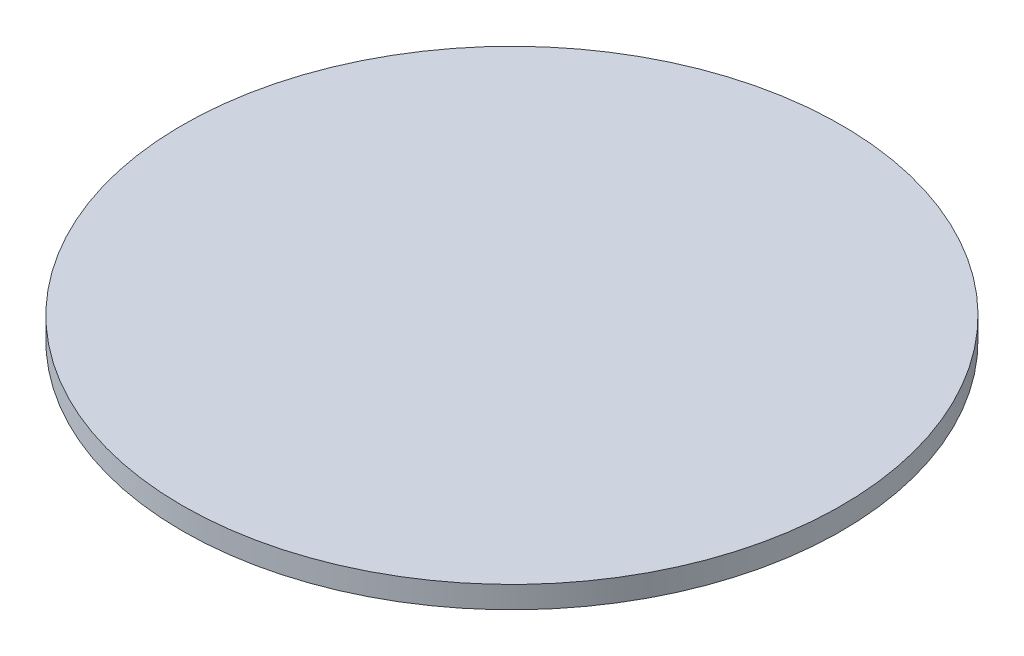
ISO-10303-21;
HEADER;
FILE_DESCRIPTION(('STEP AP214'),'2;1');
FILE_NAME('part.step','',(''),(''),'','','');
FILE_SCHEMA(('AUTOMOTIVE_DESIGN { 1 0 10303 214 1 1 1 1 }'));
ENDSEC;
DATA;
#1=APPLICATION_CONTEXT('core data for automotive mechanical design processes');
#2=APPLICATION_PROTOCOL_DEFINITION('international standard','automotive_design',2000,#1);
#3=PRODUCT_CONTEXT('',#1,'mechanical');
#4=PRODUCT('Part','Part','',(#3));
#5=PRODUCT_RELATED_PRODUCT_CATEGORY('part','',(#4));
#6=PRODUCT_DEFINITION_FORMATION('','',#4);
#7=PRODUCT_DEFINITION_CONTEXT('part definition',#1,'design');
#8=PRODUCT_DEFINITION('design','',#6,#7);
#9=PRODUCT_DEFINITION_SHAPE('','',#8);
#10=(LENGTH_UNIT() NAMED_UNIT(*) SI_UNIT(.MILLI.,.METRE.));
#11=(NAMED_UNIT(*) PLANE_ANGLE_UNIT() SI_UNIT($,.RADIAN.));
#12=(NAMED_UNIT(*) SI_UNIT($,.STERADIAN.) SOLID_ANGLE_UNIT());
#13=UNCERTAINTY_MEASURE_WITH_UNIT(LENGTH_MEASURE(1.E-05),#10,'distance_accuracy_value','');
#14=(GEOMETRIC_REPRESENTATION_CONTEXT(3) GLOBAL_UNCERTAINTY_ASSIGNED_CONTEXT((#13)) GLOBAL_UNIT_ASSIGNED_CONTEXT((#10,
#11,#12)) REPRESENTATION_CONTEXT('',''));
#15=CARTESIAN_POINT('',(0.,0.,0.));
#16=DIRECTION('',(0.,0.,1.));
#17=DIRECTION('',(1.,0.,0.));
#18=AXIS2_PLACEMENT_3D('',#15,#16,#17);
#19=CARTESIAN_POINT('',(0.,2.,0.));
#20=DIRECTION('',(0.,-1.,0.));
#21=DIRECTION('',(0.,0.,-1.));
#22=AXIS2_PLACEMENT_3D('',#19,#20,#21);
#23=CYLINDRICAL_SURFACE('',#22,30.);
#24=CARTESIAN_POINT('',(0.,2.,0.));
#25=DIRECTION('',(0.,1.,0.));
#26=DIRECTION('',(0.,0.,1.));
#27=AXIS2_PLACEMENT_3D('',#24,#25,#26);
#28=CIRCLE('',#27,30.);
#29=CARTESIAN_POINT('',(0.,2.,30.));
#30=VERTEX_POINT('',#29);
#31=EDGE_CURVE('E67',#30,#30,#28,.T.);
#32=ORIENTED_EDGE('',*,*,#31,.F.);
#33=EDGE_LOOP('',(#32));
#34=FACE_BOUND('',#33,.T.);
#35=CARTESIAN_POINT('',(0.,0.,0.));
#36=DIRECTION('',(0.,1.,0.));
#37=DIRECTION('',(0.,0.,1.));
#38=AXIS2_PLACEMENT_3D('',#35,#36,#37);
#39=CIRCLE('',#38,30.);
#40=CARTESIAN_POINT('',(0.,0.,30.));
#41=VERTEX_POINT('',#40);
#42=EDGE_CURVE('E68',#41,#41,#39,.T.);
#43=ORIENTED_EDGE('',*,*,#42,.T.);
#44=EDGE_LOOP('',(#43));
#45=FACE_BOUND('',#44,.T.);
#46=ADVANCED_FACE('F43',(#34,#45),#23,.T.);
#47=CARTESIAN_POINT('',(0.,2.,0.));
#48=DIRECTION('',(0.,1.,0.));
#49=DIRECTION('',(0.,0.,1.));
#50=AXIS2_PLACEMENT_3D('',#47,#48,#49);
#51=PLANE('',#50);
#52=ORIENTED_EDGE('',*,*,#31,.T.);
#53=EDGE_LOOP('',(#52));
#54=FACE_BOUND('',#53,.T.);
#55=ADVANCED_FACE('F98',(#54),#51,.T.);
#56=CARTESIAN_POINT('',(0.,0.,0.));
#57=DIRECTION('',(0.,1.,0.));
#58=DIRECTION('',(0.,0.,1.));
#59=AXIS2_PLACEMENT_3D('',#56,#57,#58);
#60=PLANE('',#59);
#61=CARTESIAN_POINT('',(0.,0.,0.));
#62=DIRECTION('',(0.,1.,0.));
#63=DIRECTION('',(0.,0.,1.));
#64=AXIS2_PLACEMENT_3D('',#61,#62,#63);
#65=CIRCLE('',#64,4.5);
#66=CARTESIAN_POINT('',(0.,0.,4.5));
#67=VERTEX_POINT('',#66);
#68=EDGE_CURVE('E56',#67,#67,#65,.T.);
#69=ORIENTED_EDGE('',*,*,#68,.T.);
#70=EDGE_LOOP('',(#69));
#71=FACE_BOUND('',#70,.T.);
#72=ORIENTED_EDGE('',*,*,#42,.F.);
#73=EDGE_LOOP('',(#72));
#74=FACE_BOUND('',#73,.T.);
#75=ADVANCED_FACE('F89',(#71,#74),#60,.F.);
#76=CARTESIAN_POINT('',(0.,-10.,0.));
#77=DIRECTION('',(0.,-1.,0.));
#78=DIRECTION('',(0.,0.,-1.));
#79=AXIS2_PLACEMENT_3D('',#76,#77,#78);
#80=PLANE('',#79);
#81=CARTESIAN_POINT('',(0.,-10.,0.));
#82=DIRECTION('',(0.,-1.,0.));
#83=DIRECTION('',(0.,0.,-1.));
#84=AXIS2_PLACEMENT_3D('',#81,#82,#83);
#85=CIRCLE('',#84,3.5);
#86=CARTESIAN_POINT('',(0.,-10.,-3.5));
#87=VERTEX_POINT('',#86);
#88=EDGE_CURVE('E72',#87,#87,#85,.T.);
#89=ORIENTED_EDGE('',*,*,#88,.T.);
#90=EDGE_LOOP('',(#89));
#91=FACE_BOUND('',#90,.T.);
#92=CARTESIAN_POINT('',(0.,-10.,0.));
#93=DIRECTION('',(0.,-1.,0.));
#94=DIRECTION('',(0.,0.,-1.));
#95=AXIS2_PLACEMENT_3D('',#92,#93,#94);
#96=CIRCLE('',#95,2.5);
#97=CARTESIAN_POINT('',(0.,-10.,-2.5));
#98=VERTEX_POINT('',#97);
#99=EDGE_CURVE('E79',#98,#98,#96,.T.);
#100=ORIENTED_EDGE('',*,*,#99,.F.);
#101=EDGE_LOOP('',(#100));
#102=FACE_BOUND('',#101,.T.);
#103=ADVANCED_FACE('F86',(#91,#102),#80,.T.);
#104=CARTESIAN_POINT('',(0.,-10.,0.));
#105=DIRECTION('',(0.,1.,0.));
#106=DIRECTION('',(0.,0.,1.));
#107=AXIS2_PLACEMENT_3D('',#104,#105,#106);
#108=CYLINDRICAL_SURFACE('',#107,3.5);
#109=CARTESIAN_POINT('',(0.,-0.999999999999999,0.));
#110=DIRECTION('',(0.,1.,0.));
#111=DIRECTION('',(0.,0.,1.));
#112=AXIS2_PLACEMENT_3D('',#109,#110,#111);
#113=CIRCLE('',#112,3.5);
#114=CARTESIAN_POINT('',(0.,-0.999999999999999,3.5));
#115=VERTEX_POINT('',#114);
#116=EDGE_CURVE('E61',#115,#115,#113,.F.);
#117=ORIENTED_EDGE('',*,*,#116,.T.);
#118=EDGE_LOOP('',(#117));
#119=FACE_BOUND('',#118,.T.);
#120=ORIENTED_EDGE('',*,*,#88,.F.);
#121=EDGE_LOOP('',(#120));
#122=FACE_BOUND('',#121,.T.);
#123=ADVANCED_FACE('F88',(#119,#122),#108,.T.);
#124=CARTESIAN_POINT('',(0.,-10.,0.));
#125=DIRECTION('',(0.,1.,0.));
#126=DIRECTION('',(0.,0.,1.));
#127=AXIS2_PLACEMENT_3D('',#124,#125,#126);
#128=CYLINDRICAL_SURFACE('',#127,2.5);
#129=CARTESIAN_POINT('',(0.,-0.999999999999999,0.));
#130=DIRECTION('',(0.,1.,0.));
#131=DIRECTION('',(0.,0.,1.));
#132=AXIS2_PLACEMENT_3D('',#129,#130,#131);
#133=CIRCLE('',#132,2.5);
#134=CARTESIAN_POINT('',(0.,-0.999999999999999,2.5));
#135=VERTEX_POINT('',#134);
#136=EDGE_CURVE('E10',#135,#135,#133,.T.);
#137=ORIENTED_EDGE('',*,*,#136,.T.);
#138=EDGE_LOOP('',(#137));
#139=FACE_BOUND('',#138,.T.);
#140=ORIENTED_EDGE('',*,*,#99,.T.);
#141=EDGE_LOOP('',(#140));
#142=FACE_BOUND('',#141,.T.);
#143=ADVANCED_FACE('F84',(#139,#142),#128,.F.);
#144=CARTESIAN_POINT('',(0.,0.,0.));
#145=DIRECTION('',(0.,1.,0.));
#146=DIRECTION('',(0.,0.,1.));
#147=AXIS2_PLACEMENT_3D('',#144,#145,#146);
#148=CIRCLE('',#147,1.5);
#149=CARTESIAN_POINT('',(0.,0.,1.5));
#150=VERTEX_POINT('',#149);
#151=EDGE_CURVE('E51',#150,#150,#148,.F.);
#152=ORIENTED_EDGE('',*,*,#151,.T.);
#153=EDGE_LOOP('',(#152));
#154=FACE_BOUND('',#153,.T.);
#155=ADVANCED_FACE('F101',(#154),#60,.F.);
#156=CARTESIAN_POINT('',(0.,-0.999999999999999,0.));
#157=DIRECTION('',(0.,1.,0.));
#158=DIRECTION('',(0.,0.,1.));
#159=AXIS2_PLACEMENT_3D('',#156,#157,#158);
#160=TOROIDAL_SURFACE('',#159,4.5,1.);
#161=ORIENTED_EDGE('',*,*,#68,.F.);
#162=EDGE_LOOP('',(#161));
#163=FACE_BOUND('',#162,.T.);
#164=ORIENTED_EDGE('',*,*,#116,.F.);
#165=EDGE_LOOP('',(#164));
#166=FACE_BOUND('',#165,.T.);
#167=ADVANCED_FACE('F113',(#163,#166),#160,.F.);
#168=CARTESIAN_POINT('',(0.,-0.999999999999999,0.));
#169=DIRECTION('',(0.,1.,0.));
#170=DIRECTION('',(0.,0.,1.));
#171=AXIS2_PLACEMENT_3D('',#168,#169,#170);
#172=TOROIDAL_SURFACE('',#171,1.5,1.);
#173=ORIENTED_EDGE('',*,*,#136,.F.);
#174=EDGE_LOOP('',(#173));
#175=FACE_BOUND('',#174,.T.);
#176=ORIENTED_EDGE('',*,*,#151,.F.);
#177=EDGE_LOOP('',(#176));
#178=FACE_BOUND('',#177,.T.);
#179=ADVANCED_FACE('F45',(#175,#178),#172,.F.);
#180=CLOSED_SHELL('',(#46,#55,#75,#103,#123,#143,#155,#167,#179));
#181=MANIFOLD_SOLID_BREP('B2',#180);
#182=ADVANCED_BREP_SHAPE_REPRESENTATION('',(#18,#181),#14);
#183=SHAPE_DEFINITION_REPRESENTATION(#9,#182);
ENDSEC;
END-ISO-10303-21;
